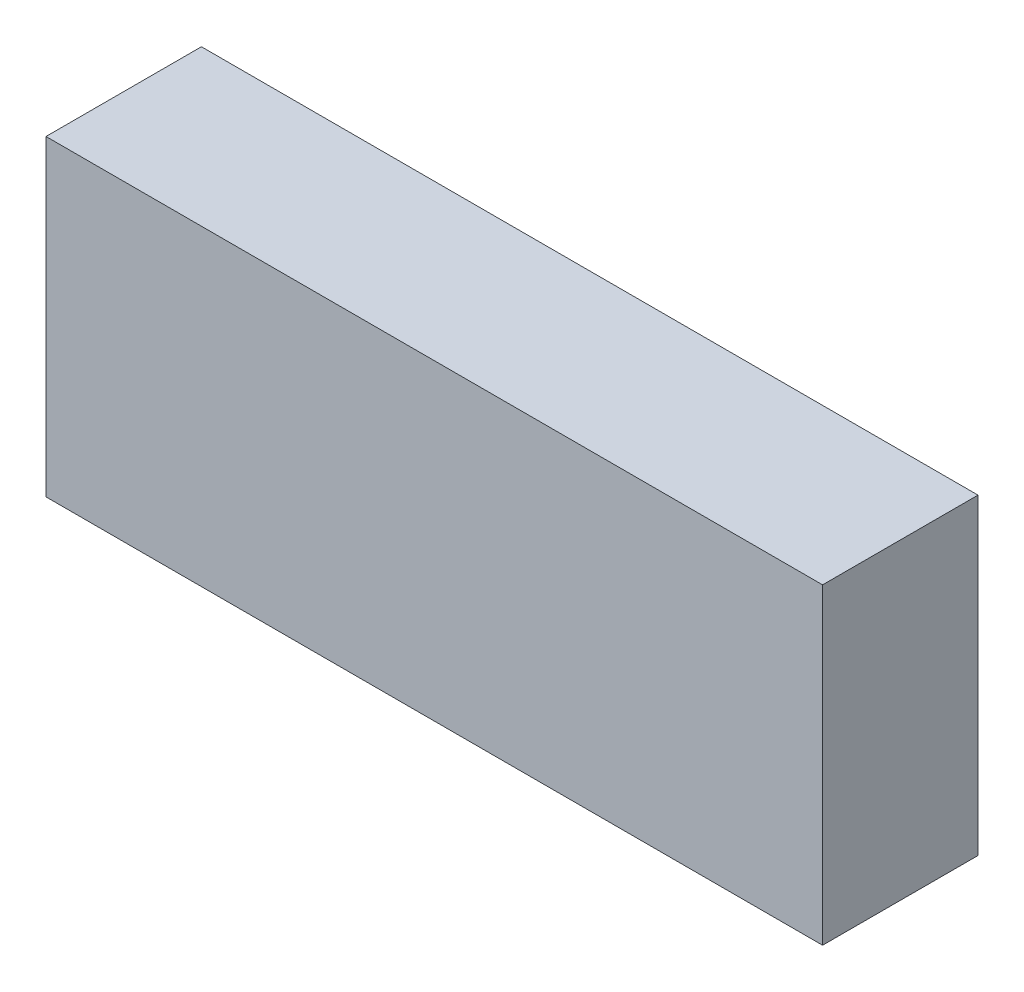
ISO-10303-21;
HEADER;
FILE_DESCRIPTION(('STEP AP214'),'2;1');
FILE_NAME('part.step','',(''),(''),'','','');
FILE_SCHEMA(('AUTOMOTIVE_DESIGN { 1 0 10303 214 1 1 1 1 }'));
ENDSEC;
DATA;
#1=APPLICATION_CONTEXT('core data for automotive mechanical design processes');
#2=APPLICATION_PROTOCOL_DEFINITION('international standard','automotive_design',2000,#1);
#3=PRODUCT_CONTEXT('',#1,'mechanical');
#4=PRODUCT('Part','Part','',(#3));
#5=PRODUCT_RELATED_PRODUCT_CATEGORY('part','',(#4));
#6=PRODUCT_DEFINITION_FORMATION('','',#4);
#7=PRODUCT_DEFINITION_CONTEXT('part definition',#1,'design');
#8=PRODUCT_DEFINITION('design','',#6,#7);
#9=PRODUCT_DEFINITION_SHAPE('','',#8);
#10=(LENGTH_UNIT() NAMED_UNIT(*) SI_UNIT(.MILLI.,.METRE.));
#11=(NAMED_UNIT(*) PLANE_ANGLE_UNIT() SI_UNIT($,.RADIAN.));
#12=(NAMED_UNIT(*) SI_UNIT($,.STERADIAN.) SOLID_ANGLE_UNIT());
#13=UNCERTAINTY_MEASURE_WITH_UNIT(LENGTH_MEASURE(1.E-05),#10,'distance_accuracy_value','');
#14=(GEOMETRIC_REPRESENTATION_CONTEXT(3) GLOBAL_UNCERTAINTY_ASSIGNED_CONTEXT((#13)) GLOBAL_UNIT_ASSIGNED_CONTEXT((#10,
#11,#12)) REPRESENTATION_CONTEXT('',''));
#15=CARTESIAN_POINT('',(0.,0.,0.));
#16=DIRECTION('',(0.,0.,1.));
#17=DIRECTION('',(1.,0.,0.));
#18=AXIS2_PLACEMENT_3D('',#15,#16,#17);
#19=CARTESIAN_POINT('',(-2.4984,-1.,1.));
#20=DIRECTION('',(1.,0.,0.));
#21=DIRECTION('',(0.,0.,-1.));
#22=AXIS2_PLACEMENT_3D('',#19,#20,#21);
#23=PLANE('',#22);
#24=DIRECTION('',(0.,-1.,0.));
#25=VECTOR('',#24,1.);
#26=CARTESIAN_POINT('',(-2.4984,-1.,0.));
#27=LINE('',#26,#25);
#28=CARTESIAN_POINT('',(-2.4984,1.0084,0.));
#29=VERTEX_POINT('',#28);
#30=CARTESIAN_POINT('',(-2.4984,-1.,0.));
#31=VERTEX_POINT('',#30);
#32=EDGE_CURVE('E96',#29,#31,#27,.T.);
#33=ORIENTED_EDGE('',*,*,#32,.T.);
#34=DIRECTION('',(0.,0.,-1.));
#35=VECTOR('',#34,1.);
#36=CARTESIAN_POINT('',(-2.4984,-1.,1.));
#37=LINE('',#36,#35);
#38=CARTESIAN_POINT('',(-2.4984,-1.,1.));
#39=VERTEX_POINT('',#38);
#40=EDGE_CURVE('E11',#39,#31,#37,.T.);
#41=ORIENTED_EDGE('',*,*,#40,.F.);
#42=DIRECTION('',(0.,-1.,0.));
#43=VECTOR('',#42,1.);
#44=CARTESIAN_POINT('',(-2.4984,-1.,1.));
#45=LINE('',#44,#43);
#46=CARTESIAN_POINT('',(-2.4984,1.0084,1.));
#47=VERTEX_POINT('',#46);
#48=EDGE_CURVE('E84',#47,#39,#45,.T.);
#49=ORIENTED_EDGE('',*,*,#48,.F.);
#50=DIRECTION('',(0.,0.,-1.));
#51=VECTOR('',#50,1.);
#52=CARTESIAN_POINT('',(-2.4984,1.0084,1.));
#53=LINE('',#52,#51);
#54=EDGE_CURVE('E92',#47,#29,#53,.T.);
#55=ORIENTED_EDGE('',*,*,#54,.T.);
#56=EDGE_LOOP('',(#33,#41,#49,#55));
#57=FACE_BOUND('',#56,.T.);
#58=ADVANCED_FACE('F33',(#57),#23,.F.);
#59=CARTESIAN_POINT('',(2.4984,-1.,1.));
#60=DIRECTION('',(0.,1.,0.));
#61=DIRECTION('',(0.,0.,1.));
#62=AXIS2_PLACEMENT_3D('',#59,#60,#61);
#63=PLANE('',#62);
#64=DIRECTION('',(1.,0.,0.));
#65=VECTOR('',#64,1.);
#66=CARTESIAN_POINT('',(2.4984,-1.,0.));
#67=LINE('',#66,#65);
#68=CARTESIAN_POINT('',(2.4984,-1.,0.));
#69=VERTEX_POINT('',#68);
#70=EDGE_CURVE('E88',#31,#69,#67,.T.);
#71=ORIENTED_EDGE('',*,*,#70,.T.);
#72=DIRECTION('',(0.,0.,-1.));
#73=VECTOR('',#72,1.);
#74=CARTESIAN_POINT('',(2.4984,-1.,1.));
#75=LINE('',#74,#73);
#76=CARTESIAN_POINT('',(2.4984,-1.,1.));
#77=VERTEX_POINT('',#76);
#78=EDGE_CURVE('E41',#77,#69,#75,.T.);
#79=ORIENTED_EDGE('',*,*,#78,.F.);
#80=DIRECTION('',(1.,0.,0.));
#81=VECTOR('',#80,1.);
#82=CARTESIAN_POINT('',(2.4984,-1.,1.));
#83=LINE('',#82,#81);
#84=EDGE_CURVE('E79',#39,#77,#83,.T.);
#85=ORIENTED_EDGE('',*,*,#84,.F.);
#86=ORIENTED_EDGE('',*,*,#40,.T.);
#87=EDGE_LOOP('',(#71,#79,#85,#86));
#88=FACE_BOUND('',#87,.T.);
#89=ADVANCED_FACE('F87',(#88),#63,.F.);
#90=CARTESIAN_POINT('',(2.4984,1.0084,1.));
#91=DIRECTION('',(-1.,0.,0.));
#92=DIRECTION('',(0.,0.,1.));
#93=AXIS2_PLACEMENT_3D('',#90,#91,#92);
#94=PLANE('',#93);
#95=DIRECTION('',(0.,1.,0.));
#96=VECTOR('',#95,1.);
#97=CARTESIAN_POINT('',(2.4984,1.0084,0.));
#98=LINE('',#97,#96);
#99=CARTESIAN_POINT('',(2.4984,1.0084,0.));
#100=VERTEX_POINT('',#99);
#101=EDGE_CURVE('E66',#69,#100,#98,.T.);
#102=ORIENTED_EDGE('',*,*,#101,.T.);
#103=DIRECTION('',(0.,0.,-1.));
#104=VECTOR('',#103,1.);
#105=CARTESIAN_POINT('',(2.4984,1.0084,1.));
#106=LINE('',#105,#104);
#107=CARTESIAN_POINT('',(2.4984,1.0084,1.));
#108=VERTEX_POINT('',#107);
#109=EDGE_CURVE('E89',#108,#100,#106,.T.);
#110=ORIENTED_EDGE('',*,*,#109,.F.);
#111=DIRECTION('',(0.,1.,0.));
#112=VECTOR('',#111,1.);
#113=CARTESIAN_POINT('',(2.4984,1.0084,1.));
#114=LINE('',#113,#112);
#115=EDGE_CURVE('E82',#77,#108,#114,.T.);
#116=ORIENTED_EDGE('',*,*,#115,.F.);
#117=ORIENTED_EDGE('',*,*,#78,.T.);
#118=EDGE_LOOP('',(#102,#110,#116,#117));
#119=FACE_BOUND('',#118,.T.);
#120=ADVANCED_FACE('F90',(#119),#94,.F.);
#121=CARTESIAN_POINT('',(-2.4984,1.0084,1.));
#122=DIRECTION('',(0.,-1.,0.));
#123=DIRECTION('',(0.,0.,-1.));
#124=AXIS2_PLACEMENT_3D('',#121,#122,#123);
#125=PLANE('',#124);
#126=DIRECTION('',(-1.,0.,0.));
#127=VECTOR('',#126,1.);
#128=CARTESIAN_POINT('',(-2.4984,1.0084,0.));
#129=LINE('',#128,#127);
#130=EDGE_CURVE('E72',#100,#29,#129,.T.);
#131=ORIENTED_EDGE('',*,*,#130,.T.);
#132=ORIENTED_EDGE('',*,*,#54,.F.);
#133=DIRECTION('',(-1.,0.,0.));
#134=VECTOR('',#133,1.);
#135=CARTESIAN_POINT('',(-2.4984,1.0084,1.));
#136=LINE('',#135,#134);
#137=EDGE_CURVE('E49',#108,#47,#136,.T.);
#138=ORIENTED_EDGE('',*,*,#137,.F.);
#139=ORIENTED_EDGE('',*,*,#109,.T.);
#140=EDGE_LOOP('',(#131,#132,#138,#139));
#141=FACE_BOUND('',#140,.T.);
#142=ADVANCED_FACE('F103',(#141),#125,.F.);
#143=CARTESIAN_POINT('',(0.,0.,1.));
#144=DIRECTION('',(0.,0.,-1.));
#145=DIRECTION('',(-1.,0.,0.));
#146=AXIS2_PLACEMENT_3D('',#143,#144,#145);
#147=PLANE('',#146);
#148=ORIENTED_EDGE('',*,*,#48,.T.);
#149=ORIENTED_EDGE('',*,*,#84,.T.);
#150=ORIENTED_EDGE('',*,*,#115,.T.);
#151=ORIENTED_EDGE('',*,*,#137,.T.);
#152=EDGE_LOOP('',(#148,#149,#150,#151));
#153=FACE_BOUND('',#152,.T.);
#154=ADVANCED_FACE('F80',(#153),#147,.F.);
#155=CARTESIAN_POINT('',(0.,0.,0.));
#156=DIRECTION('',(0.,0.,-1.));
#157=DIRECTION('',(-1.,0.,0.));
#158=AXIS2_PLACEMENT_3D('',#155,#156,#157);
#159=PLANE('',#158);
#160=ORIENTED_EDGE('',*,*,#32,.F.);
#161=ORIENTED_EDGE('',*,*,#130,.F.);
#162=ORIENTED_EDGE('',*,*,#101,.F.);
#163=ORIENTED_EDGE('',*,*,#70,.F.);
#164=EDGE_LOOP('',(#160,#161,#162,#163));
#165=FACE_BOUND('',#164,.T.);
#166=ADVANCED_FACE('F106',(#165),#159,.T.);
#167=CLOSED_SHELL('',(#58,#89,#120,#142,#154,#166));
#168=MANIFOLD_SOLID_BREP('B2',#167);
#169=ADVANCED_BREP_SHAPE_REPRESENTATION('',(#18,#168),#14);
#170=SHAPE_DEFINITION_REPRESENTATION(#9,#169);
ENDSEC;
END-ISO-10303-21;
